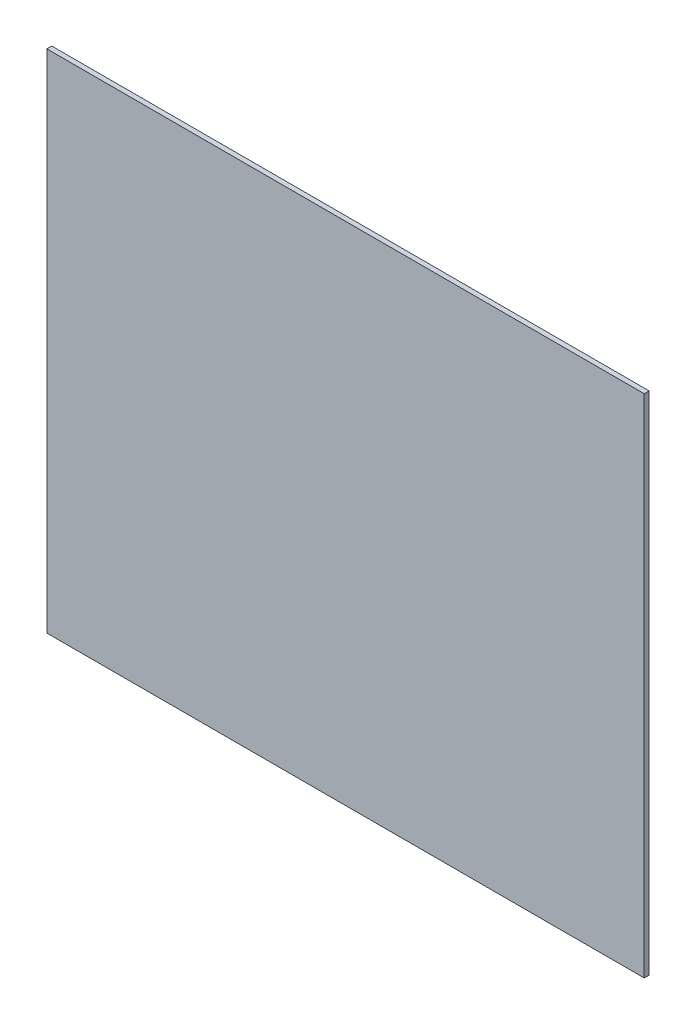
ISO-10303-21;
HEADER;
FILE_DESCRIPTION(('STEP AP214'),'2;1');
FILE_NAME('part.step','',(''),(''),'','','');
FILE_SCHEMA(('AUTOMOTIVE_DESIGN { 1 0 10303 214 1 1 1 1 }'));
ENDSEC;
DATA;
#1=APPLICATION_CONTEXT('core data for automotive mechanical design processes');
#2=APPLICATION_PROTOCOL_DEFINITION('international standard','automotive_design',2000,#1);
#3=PRODUCT_CONTEXT('',#1,'mechanical');
#4=PRODUCT('Part','Part','',(#3));
#5=PRODUCT_RELATED_PRODUCT_CATEGORY('part','',(#4));
#6=PRODUCT_DEFINITION_FORMATION('','',#4);
#7=PRODUCT_DEFINITION_CONTEXT('part definition',#1,'design');
#8=PRODUCT_DEFINITION('design','',#6,#7);
#9=PRODUCT_DEFINITION_SHAPE('','',#8);
#10=(LENGTH_UNIT() NAMED_UNIT(*) SI_UNIT(.MILLI.,.METRE.));
#11=(NAMED_UNIT(*) PLANE_ANGLE_UNIT() SI_UNIT($,.RADIAN.));
#12=(NAMED_UNIT(*) SI_UNIT($,.STERADIAN.) SOLID_ANGLE_UNIT());
#13=UNCERTAINTY_MEASURE_WITH_UNIT(LENGTH_MEASURE(1.E-05),#10,'distance_accuracy_value','');
#14=(GEOMETRIC_REPRESENTATION_CONTEXT(3) GLOBAL_UNCERTAINTY_ASSIGNED_CONTEXT((#13)) GLOBAL_UNIT_ASSIGNED_CONTEXT((#10,
#11,#12)) REPRESENTATION_CONTEXT('',''));
#15=CARTESIAN_POINT('',(0.,0.,0.));
#16=DIRECTION('',(0.,0.,1.));
#17=DIRECTION('',(1.,0.,0.));
#18=AXIS2_PLACEMENT_3D('',#15,#16,#17);
#19=CARTESIAN_POINT('',(0.,0.,3.));
#20=DIRECTION('',(1.,0.,0.));
#21=DIRECTION('',(0.,0.,-1.));
#22=AXIS2_PLACEMENT_3D('',#19,#20,#21);
#23=PLANE('',#22);
#24=DIRECTION('',(0.,-1.,0.));
#25=VECTOR('',#24,1.);
#26=CARTESIAN_POINT('',(0.,0.,0.));
#27=LINE('',#26,#25);
#28=CARTESIAN_POINT('',(0.,310.,0.));
#29=VERTEX_POINT('',#28);
#30=CARTESIAN_POINT('',(0.,0.,0.));
#31=VERTEX_POINT('',#30);
#32=EDGE_CURVE('E102',#29,#31,#27,.T.);
#33=ORIENTED_EDGE('',*,*,#32,.T.);
#34=DIRECTION('',(0.,0.,-1.));
#35=VECTOR('',#34,1.);
#36=CARTESIAN_POINT('',(0.,0.,3.));
#37=LINE('',#36,#35);
#38=CARTESIAN_POINT('',(0.,0.,3.));
#39=VERTEX_POINT('',#38);
#40=EDGE_CURVE('E11',#39,#31,#37,.T.);
#41=ORIENTED_EDGE('',*,*,#40,.F.);
#42=DIRECTION('',(0.,-1.,0.));
#43=VECTOR('',#42,1.);
#44=CARTESIAN_POINT('',(0.,0.,3.));
#45=LINE('',#44,#43);
#46=CARTESIAN_POINT('',(0.,310.,3.));
#47=VERTEX_POINT('',#46);
#48=EDGE_CURVE('E90',#47,#39,#45,.T.);
#49=ORIENTED_EDGE('',*,*,#48,.F.);
#50=DIRECTION('',(0.,0.,-1.));
#51=VECTOR('',#50,1.);
#52=CARTESIAN_POINT('',(0.,310.,3.));
#53=LINE('',#52,#51);
#54=EDGE_CURVE('E98',#47,#29,#53,.T.);
#55=ORIENTED_EDGE('',*,*,#54,.T.);
#56=EDGE_LOOP('',(#33,#41,#49,#55));
#57=FACE_BOUND('',#56,.T.);
#58=ADVANCED_FACE('F39',(#57),#23,.F.);
#59=CARTESIAN_POINT('',(0.,0.,3.));
#60=DIRECTION('',(0.,1.,0.));
#61=DIRECTION('',(0.,0.,1.));
#62=AXIS2_PLACEMENT_3D('',#59,#60,#61);
#63=PLANE('',#62);
#64=DIRECTION('',(1.,0.,0.));
#65=VECTOR('',#64,1.);
#66=CARTESIAN_POINT('',(0.,0.,0.));
#67=LINE('',#66,#65);
#68=CARTESIAN_POINT('',(366.,0.,0.));
#69=VERTEX_POINT('',#68);
#70=EDGE_CURVE('E94',#31,#69,#67,.T.);
#71=ORIENTED_EDGE('',*,*,#70,.T.);
#72=DIRECTION('',(0.,0.,-1.));
#73=VECTOR('',#72,1.);
#74=CARTESIAN_POINT('',(366.,0.,3.));
#75=LINE('',#74,#73);
#76=CARTESIAN_POINT('',(366.,0.,3.));
#77=VERTEX_POINT('',#76);
#78=EDGE_CURVE('E47',#77,#69,#75,.T.);
#79=ORIENTED_EDGE('',*,*,#78,.F.);
#80=DIRECTION('',(1.,0.,0.));
#81=VECTOR('',#80,1.);
#82=CARTESIAN_POINT('',(0.,0.,3.));
#83=LINE('',#82,#81);
#84=EDGE_CURVE('E85',#39,#77,#83,.T.);
#85=ORIENTED_EDGE('',*,*,#84,.F.);
#86=ORIENTED_EDGE('',*,*,#40,.T.);
#87=EDGE_LOOP('',(#71,#79,#85,#86));
#88=FACE_BOUND('',#87,.T.);
#89=ADVANCED_FACE('F93',(#88),#63,.F.);
#90=CARTESIAN_POINT('',(366.,0.,3.));
#91=DIRECTION('',(-1.,0.,0.));
#92=DIRECTION('',(0.,0.,1.));
#93=AXIS2_PLACEMENT_3D('',#90,#91,#92);
#94=PLANE('',#93);
#95=DIRECTION('',(0.,1.,0.));
#96=VECTOR('',#95,1.);
#97=CARTESIAN_POINT('',(366.,0.,0.));
#98=LINE('',#97,#96);
#99=CARTESIAN_POINT('',(366.,310.,0.));
#100=VERTEX_POINT('',#99);
#101=EDGE_CURVE('E72',#69,#100,#98,.T.);
#102=ORIENTED_EDGE('',*,*,#101,.T.);
#103=DIRECTION('',(0.,0.,-1.));
#104=VECTOR('',#103,1.);
#105=CARTESIAN_POINT('',(366.,310.,3.));
#106=LINE('',#105,#104);
#107=CARTESIAN_POINT('',(366.,310.,3.));
#108=VERTEX_POINT('',#107);
#109=EDGE_CURVE('E95',#108,#100,#106,.T.);
#110=ORIENTED_EDGE('',*,*,#109,.F.);
#111=DIRECTION('',(0.,1.,0.));
#112=VECTOR('',#111,1.);
#113=CARTESIAN_POINT('',(366.,0.,3.));
#114=LINE('',#113,#112);
#115=EDGE_CURVE('E88',#77,#108,#114,.T.);
#116=ORIENTED_EDGE('',*,*,#115,.F.);
#117=ORIENTED_EDGE('',*,*,#78,.T.);
#118=EDGE_LOOP('',(#102,#110,#116,#117));
#119=FACE_BOUND('',#118,.T.);
#120=ADVANCED_FACE('F96',(#119),#94,.F.);
#121=CARTESIAN_POINT('',(0.,310.,3.));
#122=DIRECTION('',(0.,-1.,0.));
#123=DIRECTION('',(0.,0.,-1.));
#124=AXIS2_PLACEMENT_3D('',#121,#122,#123);
#125=PLANE('',#124);
#126=DIRECTION('',(-1.,0.,0.));
#127=VECTOR('',#126,1.);
#128=CARTESIAN_POINT('',(0.,310.,0.));
#129=LINE('',#128,#127);
#130=EDGE_CURVE('E78',#100,#29,#129,.T.);
#131=ORIENTED_EDGE('',*,*,#130,.T.);
#132=ORIENTED_EDGE('',*,*,#54,.F.);
#133=DIRECTION('',(-1.,0.,0.));
#134=VECTOR('',#133,1.);
#135=CARTESIAN_POINT('',(0.,310.,3.));
#136=LINE('',#135,#134);
#137=EDGE_CURVE('E55',#108,#47,#136,.T.);
#138=ORIENTED_EDGE('',*,*,#137,.F.);
#139=ORIENTED_EDGE('',*,*,#109,.T.);
#140=EDGE_LOOP('',(#131,#132,#138,#139));
#141=FACE_BOUND('',#140,.T.);
#142=ADVANCED_FACE('F109',(#141),#125,.F.);
#143=CARTESIAN_POINT('',(0.,0.,3.));
#144=DIRECTION('',(0.,0.,-1.));
#145=DIRECTION('',(-1.,0.,0.));
#146=AXIS2_PLACEMENT_3D('',#143,#144,#145);
#147=PLANE('',#146);
#148=ORIENTED_EDGE('',*,*,#48,.T.);
#149=ORIENTED_EDGE('',*,*,#84,.T.);
#150=ORIENTED_EDGE('',*,*,#115,.T.);
#151=ORIENTED_EDGE('',*,*,#137,.T.);
#152=EDGE_LOOP('',(#148,#149,#150,#151));
#153=FACE_BOUND('',#152,.T.);
#154=ADVANCED_FACE('F86',(#153),#147,.F.);
#155=CARTESIAN_POINT('',(0.,0.,0.));
#156=DIRECTION('',(0.,0.,-1.));
#157=DIRECTION('',(-1.,0.,0.));
#158=AXIS2_PLACEMENT_3D('',#155,#156,#157);
#159=PLANE('',#158);
#160=ORIENTED_EDGE('',*,*,#32,.F.);
#161=ORIENTED_EDGE('',*,*,#130,.F.);
#162=ORIENTED_EDGE('',*,*,#101,.F.);
#163=ORIENTED_EDGE('',*,*,#70,.F.);
#164=EDGE_LOOP('',(#160,#161,#162,#163));
#165=FACE_BOUND('',#164,.T.);
#166=ADVANCED_FACE('F112',(#165),#159,.T.);
#167=CLOSED_SHELL('',(#58,#89,#120,#142,#154,#166));
#168=MANIFOLD_SOLID_BREP('B2',#167);
#169=ADVANCED_BREP_SHAPE_REPRESENTATION('',(#18,#168),#14);
#170=SHAPE_DEFINITION_REPRESENTATION(#9,#169);
ENDSEC;
END-ISO-10303-21;
